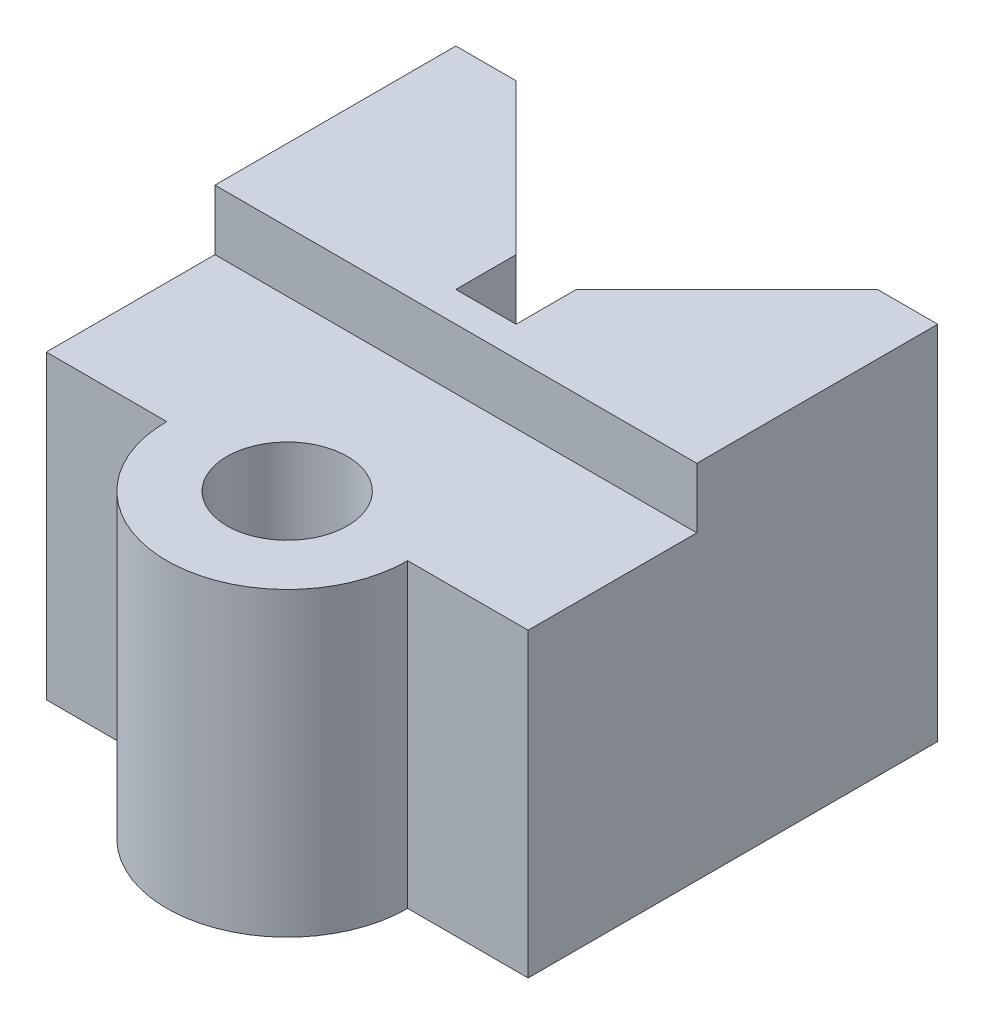
ISO-10303-21;
HEADER;
FILE_DESCRIPTION(('STEP AP214'),'2;1');
FILE_NAME('part.step','',(''),(''),'','','');
FILE_SCHEMA(('AUTOMOTIVE_DESIGN { 1 0 10303 214 1 1 1 1 }'));
ENDSEC;
DATA;
#1=APPLICATION_CONTEXT('core data for automotive mechanical design processes');
#2=APPLICATION_PROTOCOL_DEFINITION('international standard','automotive_design',2000,#1);
#3=PRODUCT_CONTEXT('',#1,'mechanical');
#4=PRODUCT('Part','Part','',(#3));
#5=PRODUCT_RELATED_PRODUCT_CATEGORY('part','',(#4));
#6=PRODUCT_DEFINITION_FORMATION('','',#4);
#7=PRODUCT_DEFINITION_CONTEXT('part definition',#1,'design');
#8=PRODUCT_DEFINITION('design','',#6,#7);
#9=PRODUCT_DEFINITION_SHAPE('','',#8);
#10=(LENGTH_UNIT() NAMED_UNIT(*) SI_UNIT(.MILLI.,.METRE.));
#11=(NAMED_UNIT(*) PLANE_ANGLE_UNIT() SI_UNIT($,.RADIAN.));
#12=(NAMED_UNIT(*) SI_UNIT($,.STERADIAN.) SOLID_ANGLE_UNIT());
#13=UNCERTAINTY_MEASURE_WITH_UNIT(LENGTH_MEASURE(1.E-05),#10,'distance_accuracy_value','');
#14=(GEOMETRIC_REPRESENTATION_CONTEXT(3) GLOBAL_UNCERTAINTY_ASSIGNED_CONTEXT((#13)) GLOBAL_UNIT_ASSIGNED_CONTEXT((#10,
#11,#12)) REPRESENTATION_CONTEXT('',''));
#15=CARTESIAN_POINT('',(0.,0.,0.));
#16=DIRECTION('',(0.,0.,1.));
#17=DIRECTION('',(1.,0.,0.));
#18=AXIS2_PLACEMENT_3D('',#15,#16,#17);
#19=CARTESIAN_POINT('',(20.0000000000001,30.,1.31838984174237E-13));
#20=DIRECTION('',(0.,0.,-1.));
#21=DIRECTION('',(-1.,0.,0.));
#22=AXIS2_PLACEMENT_3D('',#19,#20,#21);
#23=PLANE('',#22);
#24=DIRECTION('',(1.,0.,0.));
#25=VECTOR('',#24,1.);
#26=CARTESIAN_POINT('',(-20.,25.,1.31838984174237E-13));
#27=LINE('',#26,#25);
#28=CARTESIAN_POINT('',(-20.,25.,1.31838984174237E-13));
#29=VERTEX_POINT('',#28);
#30=CARTESIAN_POINT('',(-10.,25.,0.));
#31=VERTEX_POINT('',#30);
#32=EDGE_CURVE('E51',#29,#31,#27,.T.);
#33=ORIENTED_EDGE('',*,*,#32,.F.);
#34=DIRECTION('',(0.,-1.,0.));
#35=VECTOR('',#34,1.);
#36=CARTESIAN_POINT('',(-20.,30.,1.31838984174237E-13));
#37=LINE('',#36,#35);
#38=CARTESIAN_POINT('',(-20.,0.,1.31838984174237E-13));
#39=VERTEX_POINT('',#38);
#40=EDGE_CURVE('E201',#29,#39,#37,.T.);
#41=ORIENTED_EDGE('',*,*,#40,.T.);
#42=DIRECTION('',(1.,0.,0.));
#43=VECTOR('',#42,1.);
#44=CARTESIAN_POINT('',(20.0000000000001,0.,1.31838984174237E-13));
#45=LINE('',#44,#43);
#46=CARTESIAN_POINT('',(-10.,0.,1.38777878078145E-13));
#47=VERTEX_POINT('',#46);
#48=EDGE_CURVE('E59',#39,#47,#45,.T.);
#49=ORIENTED_EDGE('',*,*,#48,.T.);
#50=DIRECTION('',(0.,1.,0.));
#51=VECTOR('',#50,1.);
#52=CARTESIAN_POINT('',(-10.,-22.3606797749979,0.));
#53=LINE('',#52,#51);
#54=EDGE_CURVE('E423',#47,#31,#53,.T.);
#55=ORIENTED_EDGE('',*,*,#54,.T.);
#56=EDGE_LOOP('',(#33,#41,#49,#55));
#57=FACE_BOUND('',#56,.T.);
#58=ADVANCED_FACE('F36',(#57),#23,.F.);
#59=DIRECTION('',(1.,0.,0.));
#60=VECTOR('',#59,1.);
#61=CARTESIAN_POINT('',(10.0000000000001,25.,1.17961196366423E-13));
#62=LINE('',#61,#60);
#63=CARTESIAN_POINT('',(10.0000000000001,25.,1.17961196366423E-13));
#64=VERTEX_POINT('',#63);
#65=CARTESIAN_POINT('',(20.0000000000001,25.,1.31838984174237E-13));
#66=VERTEX_POINT('',#65);
#67=EDGE_CURVE('E426',#64,#66,#62,.T.);
#68=ORIENTED_EDGE('',*,*,#67,.F.);
#69=DIRECTION('',(0.,1.,0.));
#70=VECTOR('',#69,1.);
#71=CARTESIAN_POINT('',(10.0000000000001,-22.3606797749979,1.17961196366423E-13));
#72=LINE('',#71,#70);
#73=CARTESIAN_POINT('',(10.,0.,1.2490009027033E-13));
#74=VERTEX_POINT('',#73);
#75=EDGE_CURVE('E218',#74,#64,#72,.T.);
#76=ORIENTED_EDGE('',*,*,#75,.F.);
#77=CARTESIAN_POINT('',(20.0000000000001,0.,1.31838984174237E-13));
#78=VERTEX_POINT('',#77);
#79=EDGE_CURVE('E220',#74,#78,#45,.T.);
#80=ORIENTED_EDGE('',*,*,#79,.T.);
#81=DIRECTION('',(0.,-1.,0.));
#82=VECTOR('',#81,1.);
#83=CARTESIAN_POINT('',(20.0000000000001,30.,1.31838984174237E-13));
#84=LINE('',#83,#82);
#85=EDGE_CURVE('E199',#66,#78,#84,.T.);
#86=ORIENTED_EDGE('',*,*,#85,.F.);
#87=EDGE_LOOP('',(#68,#76,#80,#86));
#88=FACE_BOUND('',#87,.T.);
#89=ADVANCED_FACE('F279',(#88),#23,.F.);
#90=CARTESIAN_POINT('',(0.,-22.3606797749979,1.11022302462516E-13));
#91=DIRECTION('',(0.,1.,0.));
#92=DIRECTION('',(0.,0.,1.));
#93=AXIS2_PLACEMENT_3D('',#90,#91,#92);
#94=CYLINDRICAL_SURFACE('',#93,10.);
#95=ORIENTED_EDGE('',*,*,#75,.T.);
#96=CARTESIAN_POINT('',(0.,25.,1.11022302462516E-13));
#97=DIRECTION('',(0.,1.,0.));
#98=DIRECTION('',(0.,0.,1.));
#99=AXIS2_PLACEMENT_3D('',#96,#97,#98);
#100=CIRCLE('',#99,10.);
#101=EDGE_CURVE('E424',#31,#64,#100,.T.);
#102=ORIENTED_EDGE('',*,*,#101,.F.);
#103=ORIENTED_EDGE('',*,*,#54,.F.);
#104=CARTESIAN_POINT('',(0.,0.,1.11022302462516E-13));
#105=DIRECTION('',(0.,-1.,0.));
#106=DIRECTION('',(0.,0.,-1.));
#107=AXIS2_PLACEMENT_3D('',#104,#105,#106);
#108=CIRCLE('',#107,10.);
#109=EDGE_CURVE('E223',#47,#74,#108,.F.);
#110=ORIENTED_EDGE('',*,*,#109,.T.);
#111=EDGE_LOOP('',(#95,#102,#103,#110));
#112=FACE_BOUND('',#111,.T.);
#113=ADVANCED_FACE('F284',(#112),#94,.T.);
#114=CARTESIAN_POINT('',(0.,0.,1.11022302462516E-13));
#115=DIRECTION('',(0.,1.,0.));
#116=DIRECTION('',(0.,0.,1.));
#117=AXIS2_PLACEMENT_3D('',#114,#115,#116);
#118=CYLINDRICAL_SURFACE('',#117,5.);
#119=CARTESIAN_POINT('',(0.,0.,1.11022302462516E-13));
#120=DIRECTION('',(0.,1.,0.));
#121=DIRECTION('',(0.,0.,1.));
#122=AXIS2_PLACEMENT_3D('',#119,#120,#121);
#123=CIRCLE('',#122,5.);
#124=CARTESIAN_POINT('',(0.,0.,5.00000000000011));
#125=VERTEX_POINT('',#124);
#126=EDGE_CURVE('E433',#125,#125,#123,.T.);
#127=ORIENTED_EDGE('',*,*,#126,.F.);
#128=EDGE_LOOP('',(#127));
#129=FACE_BOUND('',#128,.T.);
#130=CARTESIAN_POINT('',(0.,25.,1.11022302462516E-13));
#131=DIRECTION('',(0.,1.,0.));
#132=DIRECTION('',(0.,0.,1.));
#133=AXIS2_PLACEMENT_3D('',#130,#131,#132);
#134=CIRCLE('',#133,5.);
#135=CARTESIAN_POINT('',(0.,25.,5.00000000000011));
#136=VERTEX_POINT('',#135);
#137=EDGE_CURVE('E11',#136,#136,#134,.F.);
#138=ORIENTED_EDGE('',*,*,#137,.F.);
#139=EDGE_LOOP('',(#138));
#140=FACE_BOUND('',#139,.T.);
#141=ADVANCED_FACE('F290',(#129,#140),#118,.F.);
#142=CARTESIAN_POINT('',(-20.,30.,-34.));
#143=DIRECTION('',(0.,0.,1.));
#144=DIRECTION('',(1.,0.,0.));
#145=AXIS2_PLACEMENT_3D('',#142,#143,#144);
#146=PLANE('',#145);
#147=DIRECTION('',(-1.,0.,0.));
#148=VECTOR('',#147,1.);
#149=CARTESIAN_POINT('',(-20.,0.,-34.));
#150=LINE('',#149,#148);
#151=CARTESIAN_POINT('',(-15.,0.,-34.));
#152=VERTEX_POINT('',#151);
#153=CARTESIAN_POINT('',(-20.,0.,-34.));
#154=VERTEX_POINT('',#153);
#155=EDGE_CURVE('E214',#152,#154,#150,.T.);
#156=ORIENTED_EDGE('',*,*,#155,.T.);
#157=DIRECTION('',(0.,-1.,0.));
#158=VECTOR('',#157,1.);
#159=CARTESIAN_POINT('',(-20.,30.,-34.));
#160=LINE('',#159,#158);
#161=CARTESIAN_POINT('',(-20.,30.,-34.));
#162=VERTEX_POINT('',#161);
#163=EDGE_CURVE('E44',#162,#154,#160,.T.);
#164=ORIENTED_EDGE('',*,*,#163,.F.);
#165=DIRECTION('',(-1.,0.,0.));
#166=VECTOR('',#165,1.);
#167=CARTESIAN_POINT('',(-20.,30.,-34.));
#168=LINE('',#167,#166);
#169=CARTESIAN_POINT('',(-15.,30.,-34.));
#170=VERTEX_POINT('',#169);
#171=EDGE_CURVE('E167',#170,#162,#168,.T.);
#172=ORIENTED_EDGE('',*,*,#171,.F.);
#173=DIRECTION('',(0.,-1.,0.));
#174=VECTOR('',#173,1.);
#175=CARTESIAN_POINT('',(-15.,30.,-34.));
#176=LINE('',#175,#174);
#177=EDGE_CURVE('E180',#170,#152,#176,.T.);
#178=ORIENTED_EDGE('',*,*,#177,.T.);
#179=EDGE_LOOP('',(#156,#164,#172,#178));
#180=FACE_BOUND('',#179,.T.);
#181=ADVANCED_FACE('F38',(#180),#146,.F.);
#182=CARTESIAN_POINT('',(-20.,30.,1.31838984174237E-13));
#183=DIRECTION('',(1.,0.,0.));
#184=DIRECTION('',(0.,0.,-1.));
#185=AXIS2_PLACEMENT_3D('',#182,#183,#184);
#186=PLANE('',#185);
#187=DIRECTION('',(0.,0.,1.));
#188=VECTOR('',#187,1.);
#189=CARTESIAN_POINT('',(-20.0000000000001,25.,-13.9999999999999));
#190=LINE('',#189,#188);
#191=CARTESIAN_POINT('',(-20.0000000000001,25.,-13.9999999999999));
#192=VERTEX_POINT('',#191);
#193=EDGE_CURVE('E157',#192,#29,#190,.T.);
#194=ORIENTED_EDGE('',*,*,#193,.F.);
#195=DIRECTION('',(0.,1.,0.));
#196=VECTOR('',#195,1.);
#197=CARTESIAN_POINT('',(-20.0000000000001,25.,-13.9999999999999));
#198=LINE('',#197,#196);
#199=CARTESIAN_POINT('',(-20.0000000000001,30.,-13.9999999999999));
#200=VERTEX_POINT('',#199);
#201=EDGE_CURVE('E148',#192,#200,#198,.T.);
#202=ORIENTED_EDGE('',*,*,#201,.T.);
#203=DIRECTION('',(0.,0.,1.));
#204=VECTOR('',#203,1.);
#205=CARTESIAN_POINT('',(-20.,30.,1.31838984174237E-13));
#206=LINE('',#205,#204);
#207=EDGE_CURVE('E156',#162,#200,#206,.T.);
#208=ORIENTED_EDGE('',*,*,#207,.F.);
#209=ORIENTED_EDGE('',*,*,#163,.T.);
#210=DIRECTION('',(0.,0.,1.));
#211=VECTOR('',#210,1.);
#212=CARTESIAN_POINT('',(-20.,0.,1.31838984174237E-13));
#213=LINE('',#212,#211);
#214=EDGE_CURVE('E210',#154,#39,#213,.T.);
#215=ORIENTED_EDGE('',*,*,#214,.T.);
#216=ORIENTED_EDGE('',*,*,#40,.F.);
#217=EDGE_LOOP('',(#194,#202,#208,#209,#215,#216));
#218=FACE_BOUND('',#217,.T.);
#219=ADVANCED_FACE('F208',(#218),#186,.F.);
#220=CARTESIAN_POINT('',(20.0000000000001,30.,1.31838984174237E-13));
#221=DIRECTION('',(-1.,0.,0.));
#222=DIRECTION('',(0.,0.,1.));
#223=AXIS2_PLACEMENT_3D('',#220,#221,#222);
#224=PLANE('',#223);
#225=DIRECTION('',(0.,0.,-1.));
#226=VECTOR('',#225,1.);
#227=CARTESIAN_POINT('',(20.0000000000001,30.,1.31838984174237E-13));
#228=LINE('',#227,#226);
#229=CARTESIAN_POINT('',(20.,30.,-13.9999999999999));
#230=VERTEX_POINT('',#229);
#231=CARTESIAN_POINT('',(20.0000000000001,30.,-34.));
#232=VERTEX_POINT('',#231);
#233=EDGE_CURVE('E153',#230,#232,#228,.T.);
#234=ORIENTED_EDGE('',*,*,#233,.F.);
#235=DIRECTION('',(0.,1.,0.));
#236=VECTOR('',#235,1.);
#237=CARTESIAN_POINT('',(20.,25.,-13.9999999999999));
#238=LINE('',#237,#236);
#239=CARTESIAN_POINT('',(20.,25.,-13.9999999999999));
#240=VERTEX_POINT('',#239);
#241=EDGE_CURVE('E138',#240,#230,#238,.T.);
#242=ORIENTED_EDGE('',*,*,#241,.F.);
#243=DIRECTION('',(0.,0.,-1.));
#244=VECTOR('',#243,1.);
#245=CARTESIAN_POINT('',(20.,25.,-13.9999999999999));
#246=LINE('',#245,#244);
#247=EDGE_CURVE('E430',#66,#240,#246,.T.);
#248=ORIENTED_EDGE('',*,*,#247,.F.);
#249=ORIENTED_EDGE('',*,*,#85,.T.);
#250=DIRECTION('',(0.,0.,-1.));
#251=VECTOR('',#250,1.);
#252=CARTESIAN_POINT('',(20.0000000000001,0.,1.31838984174237E-13));
#253=LINE('',#252,#251);
#254=CARTESIAN_POINT('',(20.0000000000001,0.,-34.));
#255=VERTEX_POINT('',#254);
#256=EDGE_CURVE('E228',#78,#255,#253,.T.);
#257=ORIENTED_EDGE('',*,*,#256,.T.);
#258=DIRECTION('',(0.,-1.,0.));
#259=VECTOR('',#258,1.);
#260=CARTESIAN_POINT('',(20.0000000000001,30.,-34.));
#261=LINE('',#260,#259);
#262=EDGE_CURVE('E161',#232,#255,#261,.T.);
#263=ORIENTED_EDGE('',*,*,#262,.F.);
#264=EDGE_LOOP('',(#234,#242,#248,#249,#257,#263));
#265=FACE_BOUND('',#264,.T.);
#266=ADVANCED_FACE('F159',(#265),#224,.F.);
#267=CARTESIAN_POINT('',(20.0000000000001,30.,-34.));
#268=DIRECTION('',(0.,0.,1.));
#269=DIRECTION('',(1.,0.,0.));
#270=AXIS2_PLACEMENT_3D('',#267,#268,#269);
#271=PLANE('',#270);
#272=DIRECTION('',(-1.,0.,0.));
#273=VECTOR('',#272,1.);
#274=CARTESIAN_POINT('',(20.0000000000001,0.,-34.));
#275=LINE('',#274,#273);
#276=CARTESIAN_POINT('',(15.0000000000001,0.,-34.));
#277=VERTEX_POINT('',#276);
#278=EDGE_CURVE('E230',#255,#277,#275,.T.);
#279=ORIENTED_EDGE('',*,*,#278,.T.);
#280=DIRECTION('',(0.,-1.,0.));
#281=VECTOR('',#280,1.);
#282=CARTESIAN_POINT('',(15.0000000000001,30.,-34.));
#283=LINE('',#282,#281);
#284=CARTESIAN_POINT('',(15.0000000000001,30.,-34.));
#285=VERTEX_POINT('',#284);
#286=EDGE_CURVE('E195',#285,#277,#283,.T.);
#287=ORIENTED_EDGE('',*,*,#286,.F.);
#288=DIRECTION('',(-1.,0.,0.));
#289=VECTOR('',#288,1.);
#290=CARTESIAN_POINT('',(20.0000000000001,30.,-34.));
#291=LINE('',#290,#289);
#292=EDGE_CURVE('E163',#232,#285,#291,.T.);
#293=ORIENTED_EDGE('',*,*,#292,.F.);
#294=ORIENTED_EDGE('',*,*,#262,.T.);
#295=EDGE_LOOP('',(#279,#287,#293,#294));
#296=FACE_BOUND('',#295,.T.);
#297=ADVANCED_FACE('F269',(#296),#271,.F.);
#298=CARTESIAN_POINT('',(15.0000000000001,30.,-34.));
#299=DIRECTION('',(0.707106781186549,0.,0.707106781186548));
#300=DIRECTION('',(0.707106781186548,0.,-0.707106781186549));
#301=AXIS2_PLACEMENT_3D('',#298,#299,#300);
#302=PLANE('',#301);
#303=DIRECTION('',(-0.707106781186548,0.,0.707106781186549));
#304=VECTOR('',#303,1.);
#305=CARTESIAN_POINT('',(15.0000000000001,0.,-34.));
#306=LINE('',#305,#304);
#307=CARTESIAN_POINT('',(2.50000000000004,0.,-21.4999999999999));
#308=VERTEX_POINT('',#307);
#309=EDGE_CURVE('E232',#277,#308,#306,.T.);
#310=ORIENTED_EDGE('',*,*,#309,.T.);
#311=DIRECTION('',(0.,-1.,0.));
#312=VECTOR('',#311,1.);
#313=CARTESIAN_POINT('',(2.50000000000004,30.,-21.4999999999999));
#314=LINE('',#313,#312);
#315=CARTESIAN_POINT('',(2.50000000000004,30.,-21.4999999999999));
#316=VERTEX_POINT('',#315);
#317=EDGE_CURVE('E192',#316,#308,#314,.T.);
#318=ORIENTED_EDGE('',*,*,#317,.F.);
#319=DIRECTION('',(-0.707106781186548,0.,0.707106781186549));
#320=VECTOR('',#319,1.);
#321=CARTESIAN_POINT('',(15.0000000000001,30.,-34.));
#322=LINE('',#321,#320);
#323=EDGE_CURVE('E165',#285,#316,#322,.T.);
#324=ORIENTED_EDGE('',*,*,#323,.F.);
#325=ORIENTED_EDGE('',*,*,#286,.T.);
#326=EDGE_LOOP('',(#310,#318,#324,#325));
#327=FACE_BOUND('',#326,.T.);
#328=ADVANCED_FACE('F265',(#327),#302,.F.);
#329=CARTESIAN_POINT('',(2.50000000000004,30.,-21.4999999999999));
#330=DIRECTION('',(1.,0.,0.));
#331=DIRECTION('',(0.,0.,-1.));
#332=AXIS2_PLACEMENT_3D('',#329,#330,#331);
#333=PLANE('',#332);
#334=DIRECTION('',(0.,0.,1.));
#335=VECTOR('',#334,1.);
#336=CARTESIAN_POINT('',(2.50000000000004,0.,-21.4999999999999));
#337=LINE('',#336,#335);
#338=CARTESIAN_POINT('',(2.50000000000002,0.,-16.4999999999999));
#339=VERTEX_POINT('',#338);
#340=EDGE_CURVE('E234',#308,#339,#337,.T.);
#341=ORIENTED_EDGE('',*,*,#340,.T.);
#342=DIRECTION('',(0.,-1.,0.));
#343=VECTOR('',#342,1.);
#344=CARTESIAN_POINT('',(2.50000000000002,30.,-16.4999999999999));
#345=LINE('',#344,#343);
#346=CARTESIAN_POINT('',(2.50000000000002,30.,-16.4999999999999));
#347=VERTEX_POINT('',#346);
#348=EDGE_CURVE('E189',#347,#339,#345,.T.);
#349=ORIENTED_EDGE('',*,*,#348,.F.);
#350=DIRECTION('',(0.,0.,1.));
#351=VECTOR('',#350,1.);
#352=CARTESIAN_POINT('',(2.50000000000004,30.,-21.4999999999999));
#353=LINE('',#352,#351);
#354=EDGE_CURVE('E172',#316,#347,#353,.T.);
#355=ORIENTED_EDGE('',*,*,#354,.F.);
#356=ORIENTED_EDGE('',*,*,#317,.T.);
#357=EDGE_LOOP('',(#341,#349,#355,#356));
#358=FACE_BOUND('',#357,.T.);
#359=ADVANCED_FACE('F259',(#358),#333,.F.);
#360=CARTESIAN_POINT('',(-2.49999999999997,30.,-16.4999999999999));
#361=DIRECTION('',(0.,0.,1.));
#362=DIRECTION('',(1.,0.,0.));
#363=AXIS2_PLACEMENT_3D('',#360,#361,#362);
#364=PLANE('',#363);
#365=DIRECTION('',(-1.,0.,0.));
#366=VECTOR('',#365,1.);
#367=CARTESIAN_POINT('',(-2.49999999999997,0.,-16.4999999999999));
#368=LINE('',#367,#366);
#369=CARTESIAN_POINT('',(-2.49999999999997,0.,-16.4999999999999));
#370=VERTEX_POINT('',#369);
#371=EDGE_CURVE('E236',#339,#370,#368,.T.);
#372=ORIENTED_EDGE('',*,*,#371,.T.);
#373=DIRECTION('',(0.,-1.,0.));
#374=VECTOR('',#373,1.);
#375=CARTESIAN_POINT('',(-2.49999999999997,30.,-16.4999999999999));
#376=LINE('',#375,#374);
#377=CARTESIAN_POINT('',(-2.49999999999997,30.,-16.4999999999999));
#378=VERTEX_POINT('',#377);
#379=EDGE_CURVE('E186',#378,#370,#376,.T.);
#380=ORIENTED_EDGE('',*,*,#379,.F.);
#381=DIRECTION('',(-1.,0.,0.));
#382=VECTOR('',#381,1.);
#383=CARTESIAN_POINT('',(-2.49999999999997,30.,-16.4999999999999));
#384=LINE('',#383,#382);
#385=EDGE_CURVE('E174',#347,#378,#384,.T.);
#386=ORIENTED_EDGE('',*,*,#385,.F.);
#387=ORIENTED_EDGE('',*,*,#348,.T.);
#388=EDGE_LOOP('',(#372,#380,#386,#387));
#389=FACE_BOUND('',#388,.T.);
#390=ADVANCED_FACE('F255',(#389),#364,.F.);
#391=CARTESIAN_POINT('',(-2.49999999999997,30.,-21.4999999999999));
#392=DIRECTION('',(-1.,0.,0.));
#393=DIRECTION('',(0.,0.,1.));
#394=AXIS2_PLACEMENT_3D('',#391,#392,#393);
#395=PLANE('',#394);
#396=DIRECTION('',(0.,0.,-1.));
#397=VECTOR('',#396,1.);
#398=CARTESIAN_POINT('',(-2.49999999999997,0.,-21.4999999999999));
#399=LINE('',#398,#397);
#400=CARTESIAN_POINT('',(-2.49999999999997,0.,-21.4999999999999));
#401=VERTEX_POINT('',#400);
#402=EDGE_CURVE('E238',#370,#401,#399,.T.);
#403=ORIENTED_EDGE('',*,*,#402,.T.);
#404=DIRECTION('',(0.,-1.,0.));
#405=VECTOR('',#404,1.);
#406=CARTESIAN_POINT('',(-2.49999999999997,30.,-21.4999999999999));
#407=LINE('',#406,#405);
#408=CARTESIAN_POINT('',(-2.49999999999997,30.,-21.4999999999999));
#409=VERTEX_POINT('',#408);
#410=EDGE_CURVE('E183',#409,#401,#407,.T.);
#411=ORIENTED_EDGE('',*,*,#410,.F.);
#412=DIRECTION('',(0.,0.,-1.));
#413=VECTOR('',#412,1.);
#414=CARTESIAN_POINT('',(-2.49999999999997,30.,-21.4999999999999));
#415=LINE('',#414,#413);
#416=EDGE_CURVE('E176',#378,#409,#415,.T.);
#417=ORIENTED_EDGE('',*,*,#416,.F.);
#418=ORIENTED_EDGE('',*,*,#379,.T.);
#419=EDGE_LOOP('',(#403,#411,#417,#418));
#420=FACE_BOUND('',#419,.T.);
#421=ADVANCED_FACE('F251',(#420),#395,.F.);
#422=CARTESIAN_POINT('',(-15.,30.,-34.));
#423=DIRECTION('',(-0.707106781186547,0.,0.707106781186548));
#424=DIRECTION('',(0.707106781186548,0.,0.707106781186547));
#425=AXIS2_PLACEMENT_3D('',#422,#423,#424);
#426=PLANE('',#425);
#427=DIRECTION('',(-0.707106781186548,0.,-0.707106781186547));
#428=VECTOR('',#427,1.);
#429=CARTESIAN_POINT('',(-15.,0.,-34.));
#430=LINE('',#429,#428);
#431=EDGE_CURVE('E240',#401,#152,#430,.T.);
#432=ORIENTED_EDGE('',*,*,#431,.T.);
#433=ORIENTED_EDGE('',*,*,#177,.F.);
#434=DIRECTION('',(-0.707106781186548,0.,-0.707106781186547));
#435=VECTOR('',#434,1.);
#436=CARTESIAN_POINT('',(-15.,30.,-34.));
#437=LINE('',#436,#435);
#438=EDGE_CURVE('E178',#409,#170,#437,.T.);
#439=ORIENTED_EDGE('',*,*,#438,.F.);
#440=ORIENTED_EDGE('',*,*,#410,.T.);
#441=EDGE_LOOP('',(#432,#433,#439,#440));
#442=FACE_BOUND('',#441,.T.);
#443=ADVANCED_FACE('F245',(#442),#426,.F.);
#444=CARTESIAN_POINT('',(-2.49999999999997,30.,-34.));
#445=DIRECTION('',(0.,-1.,0.));
#446=DIRECTION('',(0.,0.,-1.));
#447=AXIS2_PLACEMENT_3D('',#444,#445,#446);
#448=PLANE('',#447);
#449=ORIENTED_EDGE('',*,*,#207,.T.);
#450=DIRECTION('',(-1.,0.,0.));
#451=VECTOR('',#450,1.);
#452=CARTESIAN_POINT('',(-20.0000000000001,30.,-13.9999999999999));
#453=LINE('',#452,#451);
#454=EDGE_CURVE('E141',#230,#200,#453,.T.);
#455=ORIENTED_EDGE('',*,*,#454,.F.);
#456=ORIENTED_EDGE('',*,*,#233,.T.);
#457=ORIENTED_EDGE('',*,*,#292,.T.);
#458=ORIENTED_EDGE('',*,*,#323,.T.);
#459=ORIENTED_EDGE('',*,*,#354,.T.);
#460=ORIENTED_EDGE('',*,*,#385,.T.);
#461=ORIENTED_EDGE('',*,*,#416,.T.);
#462=ORIENTED_EDGE('',*,*,#438,.T.);
#463=ORIENTED_EDGE('',*,*,#171,.T.);
#464=EDGE_LOOP('',(#449,#455,#456,#457,#458,#459,#460,#461,#462,#463));
#465=FACE_BOUND('',#464,.T.);
#466=ADVANCED_FACE('F152',(#465),#448,.F.);
#467=CARTESIAN_POINT('',(-2.49999999999997,0.,-34.));
#468=DIRECTION('',(0.,-1.,0.));
#469=DIRECTION('',(0.,0.,-1.));
#470=AXIS2_PLACEMENT_3D('',#467,#468,#469);
#471=PLANE('',#470);
#472=ORIENTED_EDGE('',*,*,#126,.T.);
#473=EDGE_LOOP('',(#472));
#474=FACE_BOUND('',#473,.T.);
#475=ORIENTED_EDGE('',*,*,#155,.F.);
#476=ORIENTED_EDGE('',*,*,#431,.F.);
#477=ORIENTED_EDGE('',*,*,#402,.F.);
#478=ORIENTED_EDGE('',*,*,#371,.F.);
#479=ORIENTED_EDGE('',*,*,#340,.F.);
#480=ORIENTED_EDGE('',*,*,#309,.F.);
#481=ORIENTED_EDGE('',*,*,#278,.F.);
#482=ORIENTED_EDGE('',*,*,#256,.F.);
#483=ORIENTED_EDGE('',*,*,#79,.F.);
#484=ORIENTED_EDGE('',*,*,#109,.F.);
#485=ORIENTED_EDGE('',*,*,#48,.F.);
#486=ORIENTED_EDGE('',*,*,#214,.F.);
#487=EDGE_LOOP('',(#475,#476,#477,#478,#479,#480,#481,#482,#483,#484,#485,#486));
#488=FACE_BOUND('',#487,.T.);
#489=ADVANCED_FACE('F247',(#474,#488),#471,.T.);
#490=CARTESIAN_POINT('',(0.,25.,1.11022302462516E-13));
#491=DIRECTION('',(0.,1.,0.));
#492=DIRECTION('',(0.,0.,1.));
#493=AXIS2_PLACEMENT_3D('',#490,#491,#492);
#494=PLANE('',#493);
#495=ORIENTED_EDGE('',*,*,#193,.T.);
#496=ORIENTED_EDGE('',*,*,#32,.T.);
#497=ORIENTED_EDGE('',*,*,#101,.T.);
#498=ORIENTED_EDGE('',*,*,#67,.T.);
#499=ORIENTED_EDGE('',*,*,#247,.T.);
#500=DIRECTION('',(-1.,0.,0.));
#501=VECTOR('',#500,1.);
#502=CARTESIAN_POINT('',(-20.0000000000001,25.,-13.9999999999999));
#503=LINE('',#502,#501);
#504=EDGE_CURVE('E144',#240,#192,#503,.T.);
#505=ORIENTED_EDGE('',*,*,#504,.T.);
#506=EDGE_LOOP('',(#495,#496,#497,#498,#499,#505));
#507=FACE_BOUND('',#506,.T.);
#508=ORIENTED_EDGE('',*,*,#137,.T.);
#509=EDGE_LOOP('',(#508));
#510=FACE_BOUND('',#509,.T.);
#511=ADVANCED_FACE('F308',(#507,#510),#494,.T.);
#512=CARTESIAN_POINT('',(-20.0000000000001,25.,-13.9999999999999));
#513=DIRECTION('',(0.,0.,-1.));
#514=DIRECTION('',(-1.,0.,0.));
#515=AXIS2_PLACEMENT_3D('',#512,#513,#514);
#516=PLANE('',#515);
#517=ORIENTED_EDGE('',*,*,#454,.T.);
#518=ORIENTED_EDGE('',*,*,#201,.F.);
#519=ORIENTED_EDGE('',*,*,#504,.F.);
#520=ORIENTED_EDGE('',*,*,#241,.T.);
#521=EDGE_LOOP('',(#517,#518,#519,#520));
#522=FACE_BOUND('',#521,.T.);
#523=ADVANCED_FACE('F140',(#522),#516,.F.);
#524=CLOSED_SHELL('',(#58,#89,#113,#141,#181,#219,#266,#297,#328,#359,#390,#421,#443,#466,#489,
#511,#523));
#525=MANIFOLD_SOLID_BREP('B2',#524);
#526=ADVANCED_BREP_SHAPE_REPRESENTATION('',(#18,#525),#14);
#527=SHAPE_DEFINITION_REPRESENTATION(#9,#526);
ENDSEC;
END-ISO-10303-21;
